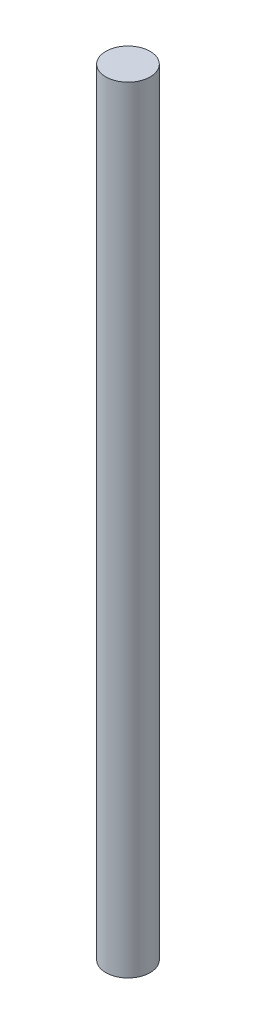
ISO-10303-21;
HEADER;
FILE_DESCRIPTION(('STEP AP214'),'2;1');
FILE_NAME('part.step','',(''),(''),'','','');
FILE_SCHEMA(('AUTOMOTIVE_DESIGN { 1 0 10303 214 1 1 1 1 }'));
ENDSEC;
DATA;
#1=APPLICATION_CONTEXT('core data for automotive mechanical design processes');
#2=APPLICATION_PROTOCOL_DEFINITION('international standard','automotive_design',2000,#1);
#3=PRODUCT_CONTEXT('',#1,'mechanical');
#4=PRODUCT('Part','Part','',(#3));
#5=PRODUCT_RELATED_PRODUCT_CATEGORY('part','',(#4));
#6=PRODUCT_DEFINITION_FORMATION('','',#4);
#7=PRODUCT_DEFINITION_CONTEXT('part definition',#1,'design');
#8=PRODUCT_DEFINITION('design','',#6,#7);
#9=PRODUCT_DEFINITION_SHAPE('','',#8);
#10=(LENGTH_UNIT() NAMED_UNIT(*) SI_UNIT(.MILLI.,.METRE.));
#11=(NAMED_UNIT(*) PLANE_ANGLE_UNIT() SI_UNIT($,.RADIAN.));
#12=(NAMED_UNIT(*) SI_UNIT($,.STERADIAN.) SOLID_ANGLE_UNIT());
#13=UNCERTAINTY_MEASURE_WITH_UNIT(LENGTH_MEASURE(1.E-05),#10,'distance_accuracy_value','');
#14=(GEOMETRIC_REPRESENTATION_CONTEXT(3) GLOBAL_UNCERTAINTY_ASSIGNED_CONTEXT((#13)) GLOBAL_UNIT_ASSIGNED_CONTEXT((#10,
#11,#12)) REPRESENTATION_CONTEXT('',''));
#15=CARTESIAN_POINT('',(0.,0.,0.));
#16=DIRECTION('',(0.,0.,1.));
#17=DIRECTION('',(1.,0.,0.));
#18=AXIS2_PLACEMENT_3D('',#15,#16,#17);
#19=CARTESIAN_POINT('',(0.,70.,0.));
#20=DIRECTION('',(0.,-1.,0.));
#21=DIRECTION('',(0.,0.,-1.));
#22=AXIS2_PLACEMENT_3D('',#19,#20,#21);
#23=CYLINDRICAL_SURFACE('',#22,2.);
#24=CARTESIAN_POINT('',(0.,70.,0.));
#25=DIRECTION('',(0.,1.,0.));
#26=DIRECTION('',(0.,0.,1.));
#27=AXIS2_PLACEMENT_3D('',#24,#25,#26);
#28=CIRCLE('',#27,2.);
#29=CARTESIAN_POINT('',(0.,70.,2.));
#30=VERTEX_POINT('',#29);
#31=EDGE_CURVE('E10',#30,#30,#28,.T.);
#32=ORIENTED_EDGE('',*,*,#31,.F.);
#33=EDGE_LOOP('',(#32));
#34=FACE_BOUND('',#33,.T.);
#35=CARTESIAN_POINT('',(0.,0.,0.));
#36=DIRECTION('',(0.,1.,0.));
#37=DIRECTION('',(0.,0.,1.));
#38=AXIS2_PLACEMENT_3D('',#35,#36,#37);
#39=CIRCLE('',#38,2.);
#40=CARTESIAN_POINT('',(0.,0.,2.));
#41=VERTEX_POINT('',#40);
#42=EDGE_CURVE('E34',#41,#41,#39,.T.);
#43=ORIENTED_EDGE('',*,*,#42,.T.);
#44=EDGE_LOOP('',(#43));
#45=FACE_BOUND('',#44,.T.);
#46=ADVANCED_FACE('F31',(#34,#45),#23,.T.);
#47=CARTESIAN_POINT('',(0.,70.,0.));
#48=DIRECTION('',(0.,1.,0.));
#49=DIRECTION('',(0.,0.,1.));
#50=AXIS2_PLACEMENT_3D('',#47,#48,#49);
#51=PLANE('',#50);
#52=ORIENTED_EDGE('',*,*,#31,.T.);
#53=EDGE_LOOP('',(#52));
#54=FACE_BOUND('',#53,.T.);
#55=ADVANCED_FACE('F46',(#54),#51,.T.);
#56=CARTESIAN_POINT('',(0.,0.,0.));
#57=DIRECTION('',(0.,1.,0.));
#58=DIRECTION('',(0.,0.,1.));
#59=AXIS2_PLACEMENT_3D('',#56,#57,#58);
#60=PLANE('',#59);
#61=ORIENTED_EDGE('',*,*,#42,.F.);
#62=EDGE_LOOP('',(#61));
#63=FACE_BOUND('',#62,.T.);
#64=ADVANCED_FACE('F44',(#63),#60,.F.);
#65=CLOSED_SHELL('',(#46,#55,#64));
#66=MANIFOLD_SOLID_BREP('B2',#65);
#67=ADVANCED_BREP_SHAPE_REPRESENTATION('',(#18,#66),#14);
#68=SHAPE_DEFINITION_REPRESENTATION(#9,#67);
ENDSEC;
END-ISO-10303-21;
